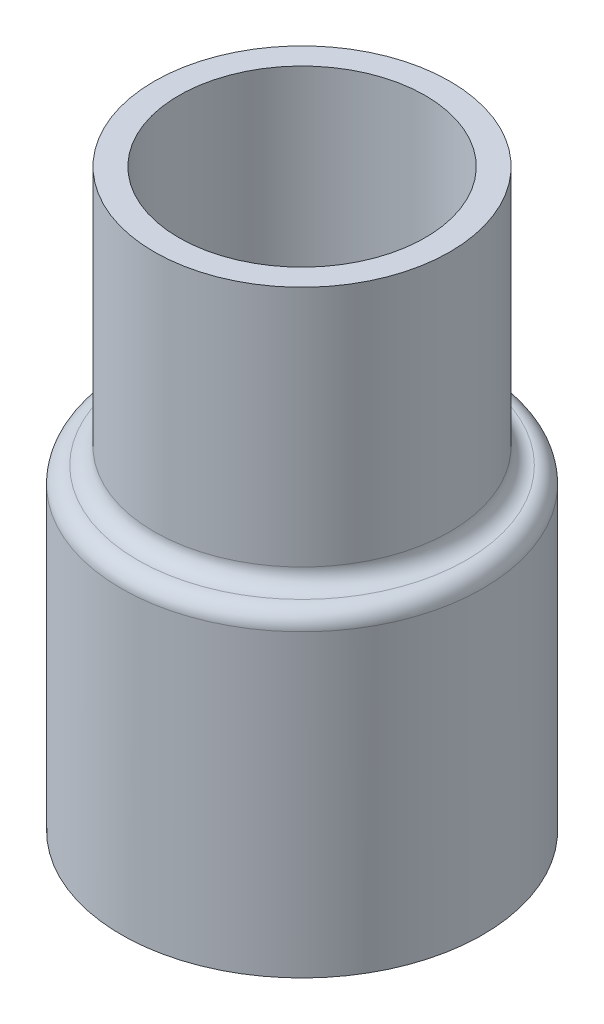
ISO-10303-21;
HEADER;
FILE_DESCRIPTION(('STEP AP214'),'2;1');
FILE_NAME('part.step','',(''),(''),'','','');
FILE_SCHEMA(('AUTOMOTIVE_DESIGN { 1 0 10303 214 1 1 1 1 }'));
ENDSEC;
DATA;
#1=APPLICATION_CONTEXT('core data for automotive mechanical design processes');
#2=APPLICATION_PROTOCOL_DEFINITION('international standard','automotive_design',2000,#1);
#3=PRODUCT_CONTEXT('',#1,'mechanical');
#4=PRODUCT('Part','Part','',(#3));
#5=PRODUCT_RELATED_PRODUCT_CATEGORY('part','',(#4));
#6=PRODUCT_DEFINITION_FORMATION('','',#4);
#7=PRODUCT_DEFINITION_CONTEXT('part definition',#1,'design');
#8=PRODUCT_DEFINITION('design','',#6,#7);
#9=PRODUCT_DEFINITION_SHAPE('','',#8);
#10=(LENGTH_UNIT() NAMED_UNIT(*) SI_UNIT(.MILLI.,.METRE.));
#11=(NAMED_UNIT(*) PLANE_ANGLE_UNIT() SI_UNIT($,.RADIAN.));
#12=(NAMED_UNIT(*) SI_UNIT($,.STERADIAN.) SOLID_ANGLE_UNIT());
#13=UNCERTAINTY_MEASURE_WITH_UNIT(LENGTH_MEASURE(1.E-05),#10,'distance_accuracy_value','');
#14=(GEOMETRIC_REPRESENTATION_CONTEXT(3) GLOBAL_UNCERTAINTY_ASSIGNED_CONTEXT((#13)) GLOBAL_UNIT_ASSIGNED_CONTEXT((#10,
#11,#12)) REPRESENTATION_CONTEXT('',''));
#15=CARTESIAN_POINT('',(0.,0.,0.));
#16=DIRECTION('',(0.,0.,1.));
#17=DIRECTION('',(1.,0.,0.));
#18=AXIS2_PLACEMENT_3D('',#15,#16,#17);
#19=CARTESIAN_POINT('',(0.,-17.5,0.));
#20=DIRECTION('',(0.,-1.,0.));
#21=DIRECTION('',(0.,0.,-1.));
#22=AXIS2_PLACEMENT_3D('',#19,#20,#21);
#23=CYLINDRICAL_SURFACE('',#22,7.5);
#24=CARTESIAN_POINT('',(0.,-1.75,0.));
#25=DIRECTION('',(0.,-1.,0.));
#26=DIRECTION('',(0.,0.,-1.));
#27=AXIS2_PLACEMENT_3D('',#24,#25,#26);
#28=CIRCLE('',#27,7.5);
#29=CARTESIAN_POINT('',(0.,-1.75,-7.5));
#30=VERTEX_POINT('',#29);
#31=EDGE_CURVE('E59',#30,#30,#28,.T.);
#32=ORIENTED_EDGE('',*,*,#31,.T.);
#33=EDGE_LOOP('',(#32));
#34=FACE_BOUND('',#33,.T.);
#35=CARTESIAN_POINT('',(0.,17.5,0.));
#36=DIRECTION('',(0.,-1.,0.));
#37=DIRECTION('',(0.,0.,-1.));
#38=AXIS2_PLACEMENT_3D('',#35,#36,#37);
#39=CIRCLE('',#38,7.5);
#40=CARTESIAN_POINT('',(0.,17.5,-7.5));
#41=VERTEX_POINT('',#40);
#42=EDGE_CURVE('E42',#41,#41,#39,.T.);
#43=ORIENTED_EDGE('',*,*,#42,.F.);
#44=EDGE_LOOP('',(#43));
#45=FACE_BOUND('',#44,.T.);
#46=ADVANCED_FACE('F30',(#34,#45),#23,.F.);
#47=CARTESIAN_POINT('',(0.,17.5,-7.5));
#48=DIRECTION('',(0.,1.,0.));
#49=DIRECTION('',(0.,0.,1.));
#50=AXIS2_PLACEMENT_3D('',#47,#48,#49);
#51=PLANE('',#50);
#52=ORIENTED_EDGE('',*,*,#42,.T.);
#53=EDGE_LOOP('',(#52));
#54=FACE_BOUND('',#53,.T.);
#55=CARTESIAN_POINT('',(0.,17.5,0.));
#56=DIRECTION('',(0.,-1.,0.));
#57=DIRECTION('',(0.,0.,-1.));
#58=AXIS2_PLACEMENT_3D('',#55,#56,#57);
#59=CIRCLE('',#58,9.);
#60=CARTESIAN_POINT('',(0.,17.5,-9.));
#61=VERTEX_POINT('',#60);
#62=EDGE_CURVE('E47',#61,#61,#59,.T.);
#63=ORIENTED_EDGE('',*,*,#62,.F.);
#64=EDGE_LOOP('',(#63));
#65=FACE_BOUND('',#64,.T.);
#66=ADVANCED_FACE('F80',(#54,#65),#51,.T.);
#67=CARTESIAN_POINT('',(0.,-17.5,0.));
#68=DIRECTION('',(0.,-1.,0.));
#69=DIRECTION('',(0.,0.,-1.));
#70=AXIS2_PLACEMENT_3D('',#67,#68,#69);
#71=CYLINDRICAL_SURFACE('',#70,9.);
#72=CARTESIAN_POINT('',(0.,2.75,0.));
#73=DIRECTION('',(0.,1.,0.));
#74=DIRECTION('',(0.,0.,1.));
#75=AXIS2_PLACEMENT_3D('',#72,#73,#74);
#76=CIRCLE('',#75,9.);
#77=CARTESIAN_POINT('',(0.,2.75,9.));
#78=VERTEX_POINT('',#77);
#79=EDGE_CURVE('E38',#78,#78,#76,.T.);
#80=ORIENTED_EDGE('',*,*,#79,.T.);
#81=EDGE_LOOP('',(#80));
#82=FACE_BOUND('',#81,.T.);
#83=ORIENTED_EDGE('',*,*,#62,.T.);
#84=EDGE_LOOP('',(#83));
#85=FACE_BOUND('',#84,.T.);
#86=ADVANCED_FACE('F85',(#82,#85),#71,.T.);
#87=CARTESIAN_POINT('',(0.,-17.5,0.));
#88=DIRECTION('',(0.,-1.,0.));
#89=DIRECTION('',(0.,0.,-1.));
#90=AXIS2_PLACEMENT_3D('',#87,#88,#89);
#91=CYLINDRICAL_SURFACE('',#90,11.);
#92=CARTESIAN_POINT('',(0.,0.750000000000001,0.));
#93=DIRECTION('',(0.,1.,0.));
#94=DIRECTION('',(0.,0.,1.));
#95=AXIS2_PLACEMENT_3D('',#92,#93,#94);
#96=CIRCLE('',#95,11.);
#97=CARTESIAN_POINT('',(0.,0.750000000000001,11.));
#98=VERTEX_POINT('',#97);
#99=EDGE_CURVE('E10',#98,#98,#96,.F.);
#100=ORIENTED_EDGE('',*,*,#99,.T.);
#101=EDGE_LOOP('',(#100));
#102=FACE_BOUND('',#101,.T.);
#103=CARTESIAN_POINT('',(0.,-17.5,0.));
#104=DIRECTION('',(0.,-1.,0.));
#105=DIRECTION('',(0.,0.,-1.));
#106=AXIS2_PLACEMENT_3D('',#103,#104,#105);
#107=CIRCLE('',#106,11.);
#108=CARTESIAN_POINT('',(0.,-17.5,-11.));
#109=VERTEX_POINT('',#108);
#110=EDGE_CURVE('E50',#109,#109,#107,.T.);
#111=ORIENTED_EDGE('',*,*,#110,.F.);
#112=EDGE_LOOP('',(#111));
#113=FACE_BOUND('',#112,.T.);
#114=ADVANCED_FACE('F92',(#102,#113),#91,.T.);
#115=CARTESIAN_POINT('',(0.,-17.5,-11.));
#116=DIRECTION('',(0.,-1.,0.));
#117=DIRECTION('',(0.,0.,-1.));
#118=AXIS2_PLACEMENT_3D('',#115,#116,#117);
#119=PLANE('',#118);
#120=ORIENTED_EDGE('',*,*,#110,.T.);
#121=EDGE_LOOP('',(#120));
#122=FACE_BOUND('',#121,.T.);
#123=CARTESIAN_POINT('',(0.,-17.5,0.));
#124=DIRECTION('',(0.,-1.,0.));
#125=DIRECTION('',(0.,0.,-1.));
#126=AXIS2_PLACEMENT_3D('',#123,#124,#125);
#127=CIRCLE('',#126,9.5);
#128=CARTESIAN_POINT('',(0.,-17.5,-9.5));
#129=VERTEX_POINT('',#128);
#130=EDGE_CURVE('E53',#129,#129,#127,.T.);
#131=ORIENTED_EDGE('',*,*,#130,.F.);
#132=EDGE_LOOP('',(#131));
#133=FACE_BOUND('',#132,.T.);
#134=ADVANCED_FACE('F96',(#122,#133),#119,.T.);
#135=CARTESIAN_POINT('',(0.,-17.5,0.));
#136=DIRECTION('',(0.,-1.,0.));
#137=DIRECTION('',(0.,0.,-1.));
#138=AXIS2_PLACEMENT_3D('',#135,#136,#137);
#139=CYLINDRICAL_SURFACE('',#138,9.5);
#140=ORIENTED_EDGE('',*,*,#130,.T.);
#141=EDGE_LOOP('',(#140));
#142=FACE_BOUND('',#141,.T.);
#143=CARTESIAN_POINT('',(0.,-1.75,0.));
#144=DIRECTION('',(0.,-1.,0.));
#145=DIRECTION('',(0.,0.,-1.));
#146=AXIS2_PLACEMENT_3D('',#143,#144,#145);
#147=CIRCLE('',#146,9.5);
#148=CARTESIAN_POINT('',(0.,-1.75,-9.5));
#149=VERTEX_POINT('',#148);
#150=EDGE_CURVE('E56',#149,#149,#147,.T.);
#151=ORIENTED_EDGE('',*,*,#150,.F.);
#152=EDGE_LOOP('',(#151));
#153=FACE_BOUND('',#152,.T.);
#154=ADVANCED_FACE('F76',(#142,#153),#139,.F.);
#155=CARTESIAN_POINT('',(0.,-1.75,-9.5));
#156=DIRECTION('',(0.,-1.,0.));
#157=DIRECTION('',(0.,0.,-1.));
#158=AXIS2_PLACEMENT_3D('',#155,#156,#157);
#159=PLANE('',#158);
#160=ORIENTED_EDGE('',*,*,#150,.T.);
#161=EDGE_LOOP('',(#160));
#162=FACE_BOUND('',#161,.T.);
#163=ORIENTED_EDGE('',*,*,#31,.F.);
#164=EDGE_LOOP('',(#163));
#165=FACE_BOUND('',#164,.T.);
#166=ADVANCED_FACE('F69',(#162,#165),#159,.T.);
#167=CARTESIAN_POINT('',(0.,0.750000000000001,0.));
#168=DIRECTION('',(0.,1.,0.));
#169=DIRECTION('',(0.,0.,1.));
#170=AXIS2_PLACEMENT_3D('',#167,#168,#169);
#171=TOROIDAL_SURFACE('',#170,10.,1.);
#172=ORIENTED_EDGE('',*,*,#99,.F.);
#173=EDGE_LOOP('',(#172));
#174=FACE_BOUND('',#173,.T.);
#175=CARTESIAN_POINT('',(0.,1.75,0.));
#176=DIRECTION('',(0.,1.,0.));
#177=DIRECTION('',(0.,0.,1.));
#178=AXIS2_PLACEMENT_3D('',#175,#176,#177);
#179=CIRCLE('',#178,10.);
#180=CARTESIAN_POINT('',(0.,1.75,10.));
#181=VERTEX_POINT('',#180);
#182=EDGE_CURVE('E34',#181,#181,#179,.T.);
#183=ORIENTED_EDGE('',*,*,#182,.F.);
#184=EDGE_LOOP('',(#183));
#185=FACE_BOUND('',#184,.T.);
#186=ADVANCED_FACE('F32',(#174,#185),#171,.T.);
#187=CARTESIAN_POINT('',(0.,2.75,0.));
#188=DIRECTION('',(0.,1.,0.));
#189=DIRECTION('',(0.,0.,1.));
#190=AXIS2_PLACEMENT_3D('',#187,#188,#189);
#191=TOROIDAL_SURFACE('',#190,10.,1.);
#192=ORIENTED_EDGE('',*,*,#79,.F.);
#193=EDGE_LOOP('',(#192));
#194=FACE_BOUND('',#193,.T.);
#195=ORIENTED_EDGE('',*,*,#182,.T.);
#196=EDGE_LOOP('',(#195));
#197=FACE_BOUND('',#196,.T.);
#198=ADVANCED_FACE('F66',(#194,#197),#191,.F.);
#199=CLOSED_SHELL('',(#46,#66,#86,#114,#134,#154,#166,#186,#198));
#200=MANIFOLD_SOLID_BREP('B2',#199);
#201=ADVANCED_BREP_SHAPE_REPRESENTATION('',(#18,#200),#14);
#202=SHAPE_DEFINITION_REPRESENTATION(#9,#201);
ENDSEC;
END-ISO-10303-21;
